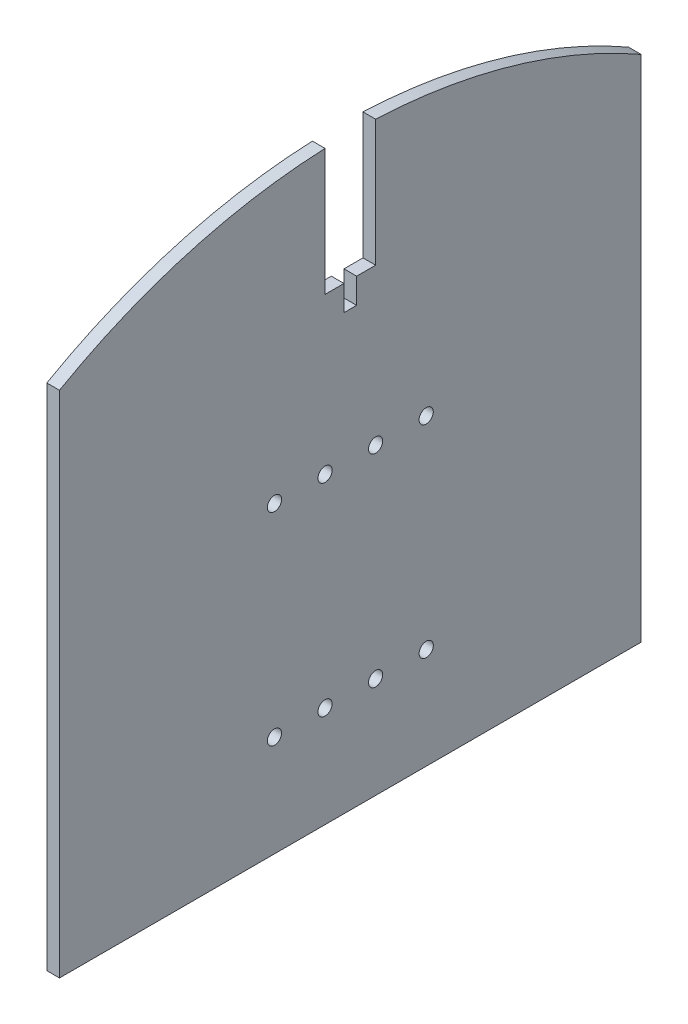
ISO-10303-21;
HEADER;
FILE_DESCRIPTION(('STEP AP214'),'2;1');
FILE_NAME('part.step','',(''),(''),'','','');
FILE_SCHEMA(('AUTOMOTIVE_DESIGN { 1 0 10303 214 1 1 1 1 }'));
ENDSEC;
DATA;
#1=APPLICATION_CONTEXT('core data for automotive mechanical design processes');
#2=APPLICATION_PROTOCOL_DEFINITION('international standard','automotive_design',2000,#1);
#3=PRODUCT_CONTEXT('',#1,'mechanical');
#4=PRODUCT('Part','Part','',(#3));
#5=PRODUCT_RELATED_PRODUCT_CATEGORY('part','',(#4));
#6=PRODUCT_DEFINITION_FORMATION('','',#4);
#7=PRODUCT_DEFINITION_CONTEXT('part definition',#1,'design');
#8=PRODUCT_DEFINITION('design','',#6,#7);
#9=PRODUCT_DEFINITION_SHAPE('','',#8);
#10=(LENGTH_UNIT() NAMED_UNIT(*) SI_UNIT(.MILLI.,.METRE.));
#11=(NAMED_UNIT(*) PLANE_ANGLE_UNIT() SI_UNIT($,.RADIAN.));
#12=(NAMED_UNIT(*) SI_UNIT($,.STERADIAN.) SOLID_ANGLE_UNIT());
#13=UNCERTAINTY_MEASURE_WITH_UNIT(LENGTH_MEASURE(1.E-05),#10,'distance_accuracy_value','');
#14=(GEOMETRIC_REPRESENTATION_CONTEXT(3) GLOBAL_UNCERTAINTY_ASSIGNED_CONTEXT((#13)) GLOBAL_UNIT_ASSIGNED_CONTEXT((#10,
#11,#12)) REPRESENTATION_CONTEXT('',''));
#15=CARTESIAN_POINT('',(0.,0.,0.));
#16=DIRECTION('',(0.,0.,1.));
#17=DIRECTION('',(1.,0.,0.));
#18=AXIS2_PLACEMENT_3D('',#15,#16,#17);
#19=CARTESIAN_POINT('',(6.35,230.611929367035,3.17500000000004));
#20=DIRECTION('',(0.,0.,1.));
#21=DIRECTION('',(0.,-1.,0.));
#22=AXIS2_PLACEMENT_3D('',#19,#20,#21);
#23=PLANE('',#22);
#24=DIRECTION('',(0.,1.,0.));
#25=VECTOR('',#24,1.);
#26=CARTESIAN_POINT('',(0.,230.611929367035,3.17500000000004));
#27=LINE('',#26,#25);
#28=CARTESIAN_POINT('',(0.,217.911929367035,3.17500000000004));
#29=VERTEX_POINT('',#28);
#30=CARTESIAN_POINT('',(0.,230.611929367035,3.17500000000004));
#31=VERTEX_POINT('',#30);
#32=EDGE_CURVE('E152',#29,#31,#27,.T.);
#33=ORIENTED_EDGE('',*,*,#32,.T.);
#34=DIRECTION('',(-1.,0.,0.));
#35=VECTOR('',#34,1.);
#36=CARTESIAN_POINT('',(6.35,230.611929367035,3.17500000000004));
#37=LINE('',#36,#35);
#38=CARTESIAN_POINT('',(6.35,230.611929367035,3.17500000000004));
#39=VERTEX_POINT('',#38);
#40=EDGE_CURVE('E11',#39,#31,#37,.T.);
#41=ORIENTED_EDGE('',*,*,#40,.F.);
#42=DIRECTION('',(0.,1.,0.));
#43=VECTOR('',#42,1.);
#44=CARTESIAN_POINT('',(6.35,230.611929367035,3.17500000000004));
#45=LINE('',#44,#43);
#46=CARTESIAN_POINT('',(6.35,217.911929367035,3.17500000000004));
#47=VERTEX_POINT('',#46);
#48=EDGE_CURVE('E176',#47,#39,#45,.T.);
#49=ORIENTED_EDGE('',*,*,#48,.F.);
#50=DIRECTION('',(-1.,0.,0.));
#51=VECTOR('',#50,1.);
#52=CARTESIAN_POINT('',(6.35,217.911929367035,3.17500000000004));
#53=LINE('',#52,#51);
#54=EDGE_CURVE('E148',#47,#29,#53,.T.);
#55=ORIENTED_EDGE('',*,*,#54,.T.);
#56=EDGE_LOOP('',(#33,#41,#49,#55));
#57=FACE_BOUND('',#56,.T.);
#58=ADVANCED_FACE('F32',(#57),#23,.F.);
#59=CARTESIAN_POINT('',(6.35,230.611929367035,12.7));
#60=DIRECTION('',(0.,-1.,0.));
#61=DIRECTION('',(0.,0.,-1.));
#62=AXIS2_PLACEMENT_3D('',#59,#60,#61);
#63=PLANE('',#62);
#64=DIRECTION('',(0.,0.,1.));
#65=VECTOR('',#64,1.);
#66=CARTESIAN_POINT('',(0.,230.611929367035,12.7));
#67=LINE('',#66,#65);
#68=CARTESIAN_POINT('',(0.,230.611929367035,12.7));
#69=VERTEX_POINT('',#68);
#70=EDGE_CURVE('E155',#31,#69,#67,.T.);
#71=ORIENTED_EDGE('',*,*,#70,.T.);
#72=DIRECTION('',(-1.,0.,0.));
#73=VECTOR('',#72,1.);
#74=CARTESIAN_POINT('',(6.35,230.611929367035,12.7));
#75=LINE('',#74,#73);
#76=CARTESIAN_POINT('',(6.35,230.611929367035,12.7));
#77=VERTEX_POINT('',#76);
#78=EDGE_CURVE('E40',#77,#69,#75,.T.);
#79=ORIENTED_EDGE('',*,*,#78,.F.);
#80=DIRECTION('',(0.,0.,1.));
#81=VECTOR('',#80,1.);
#82=CARTESIAN_POINT('',(6.35,230.611929367035,12.7));
#83=LINE('',#82,#81);
#84=EDGE_CURVE('E103',#39,#77,#83,.T.);
#85=ORIENTED_EDGE('',*,*,#84,.F.);
#86=ORIENTED_EDGE('',*,*,#40,.T.);
#87=EDGE_LOOP('',(#71,#79,#85,#86));
#88=FACE_BOUND('',#87,.T.);
#89=ADVANCED_FACE('F254',(#88),#63,.F.);
#90=CARTESIAN_POINT('',(6.35,294.111929367035,12.7));
#91=DIRECTION('',(0.,0.,1.));
#92=DIRECTION('',(0.,-1.,0.));
#93=AXIS2_PLACEMENT_3D('',#90,#91,#92);
#94=PLANE('',#93);
#95=DIRECTION('',(0.,1.,0.));
#96=VECTOR('',#95,1.);
#97=CARTESIAN_POINT('',(0.,294.111929367035,12.7));
#98=LINE('',#97,#96);
#99=CARTESIAN_POINT('',(0.,294.111929367035,12.7));
#100=VERTEX_POINT('',#99);
#101=EDGE_CURVE('E158',#69,#100,#98,.T.);
#102=ORIENTED_EDGE('',*,*,#101,.T.);
#103=DIRECTION('',(-1.,0.,0.));
#104=VECTOR('',#103,1.);
#105=CARTESIAN_POINT('',(6.35,294.111929367035,12.7));
#106=LINE('',#105,#104);
#107=CARTESIAN_POINT('',(6.35,294.111929367035,12.7));
#108=VERTEX_POINT('',#107);
#109=EDGE_CURVE('E195',#108,#100,#106,.T.);
#110=ORIENTED_EDGE('',*,*,#109,.F.);
#111=DIRECTION('',(0.,1.,0.));
#112=VECTOR('',#111,1.);
#113=CARTESIAN_POINT('',(6.35,294.111929367035,12.7));
#114=LINE('',#113,#112);
#115=EDGE_CURVE('E203',#77,#108,#114,.T.);
#116=ORIENTED_EDGE('',*,*,#115,.F.);
#117=ORIENTED_EDGE('',*,*,#78,.T.);
#118=EDGE_LOOP('',(#102,#110,#116,#117));
#119=FACE_BOUND('',#118,.T.);
#120=ADVANCED_FACE('F201',(#119),#94,.F.);
#121=CARTESIAN_POINT('',(6.35,0.,0.));
#122=DIRECTION('',(-1.,0.,0.));
#123=DIRECTION('',(0.,0.,1.));
#124=AXIS2_PLACEMENT_3D('',#121,#122,#123);
#125=CYLINDRICAL_SURFACE('',#124,294.386);
#126=CARTESIAN_POINT('',(0.,0.,0.));
#127=DIRECTION('',(1.,0.,0.));
#128=DIRECTION('',(0.,0.,1.));
#129=AXIS2_PLACEMENT_3D('',#126,#127,#128);
#130=CIRCLE('',#129,294.386);
#131=CARTESIAN_POINT('',(0.,255.602258393779,146.05));
#132=VERTEX_POINT('',#131);
#133=EDGE_CURVE('E160',#100,#132,#130,.T.);
#134=ORIENTED_EDGE('',*,*,#133,.T.);
#135=DIRECTION('',(-1.,0.,0.));
#136=VECTOR('',#135,1.);
#137=CARTESIAN_POINT('',(6.35,255.602258393779,146.05));
#138=LINE('',#137,#136);
#139=CARTESIAN_POINT('',(6.35,255.602258393779,146.05));
#140=VERTEX_POINT('',#139);
#141=EDGE_CURVE('E192',#140,#132,#138,.T.);
#142=ORIENTED_EDGE('',*,*,#141,.F.);
#143=CARTESIAN_POINT('',(6.35,0.,0.));
#144=DIRECTION('',(1.,0.,0.));
#145=DIRECTION('',(0.,0.,1.));
#146=AXIS2_PLACEMENT_3D('',#143,#144,#145);
#147=CIRCLE('',#146,294.386);
#148=EDGE_CURVE('E220',#108,#140,#147,.T.);
#149=ORIENTED_EDGE('',*,*,#148,.F.);
#150=ORIENTED_EDGE('',*,*,#109,.T.);
#151=EDGE_LOOP('',(#134,#142,#149,#150));
#152=FACE_BOUND('',#151,.T.);
#153=ADVANCED_FACE('F211',(#152),#125,.T.);
#154=CARTESIAN_POINT('',(6.35,255.602258393779,146.05));
#155=DIRECTION('',(0.,0.,-1.));
#156=DIRECTION('',(-1.,0.,0.));
#157=AXIS2_PLACEMENT_3D('',#154,#155,#156);
#158=PLANE('',#157);
#159=DIRECTION('',(0.,-1.,0.));
#160=VECTOR('',#159,1.);
#161=CARTESIAN_POINT('',(0.,255.602258393779,146.05));
#162=LINE('',#161,#160);
#163=CARTESIAN_POINT('',(0.,0.,146.05));
#164=VERTEX_POINT('',#163);
#165=EDGE_CURVE('E162',#132,#164,#162,.T.);
#166=ORIENTED_EDGE('',*,*,#165,.T.);
#167=DIRECTION('',(-1.,0.,0.));
#168=VECTOR('',#167,1.);
#169=CARTESIAN_POINT('',(6.35,0.,146.05));
#170=LINE('',#169,#168);
#171=CARTESIAN_POINT('',(6.35,0.,146.05));
#172=VERTEX_POINT('',#171);
#173=EDGE_CURVE('E189',#172,#164,#170,.T.);
#174=ORIENTED_EDGE('',*,*,#173,.F.);
#175=DIRECTION('',(0.,-1.,0.));
#176=VECTOR('',#175,1.);
#177=CARTESIAN_POINT('',(6.35,255.602258393779,146.05));
#178=LINE('',#177,#176);
#179=EDGE_CURVE('E217',#140,#172,#178,.T.);
#180=ORIENTED_EDGE('',*,*,#179,.F.);
#181=ORIENTED_EDGE('',*,*,#141,.T.);
#182=EDGE_LOOP('',(#166,#174,#180,#181));
#183=FACE_BOUND('',#182,.T.);
#184=ADVANCED_FACE('F215',(#183),#158,.F.);
#185=CARTESIAN_POINT('',(6.35,0.,0.));
#186=DIRECTION('',(0.,1.,0.));
#187=DIRECTION('',(0.,0.,1.));
#188=AXIS2_PLACEMENT_3D('',#185,#186,#187);
#189=PLANE('',#188);
#190=DIRECTION('',(0.,0.,-1.));
#191=VECTOR('',#190,1.);
#192=CARTESIAN_POINT('',(0.,0.,0.));
#193=LINE('',#192,#191);
#194=CARTESIAN_POINT('',(0.,0.,-146.05));
#195=VERTEX_POINT('',#194);
#196=EDGE_CURVE('E165',#164,#195,#193,.T.);
#197=ORIENTED_EDGE('',*,*,#196,.T.);
#198=DIRECTION('',(-1.,0.,0.));
#199=VECTOR('',#198,1.);
#200=CARTESIAN_POINT('',(6.35,0.,-146.05));
#201=LINE('',#200,#199);
#202=CARTESIAN_POINT('',(6.35,0.,-146.05));
#203=VERTEX_POINT('',#202);
#204=EDGE_CURVE('E186',#203,#195,#201,.T.);
#205=ORIENTED_EDGE('',*,*,#204,.F.);
#206=DIRECTION('',(0.,0.,-1.));
#207=VECTOR('',#206,1.);
#208=CARTESIAN_POINT('',(6.35,0.,146.05));
#209=LINE('',#208,#207);
#210=EDGE_CURVE('E219',#172,#203,#209,.T.);
#211=ORIENTED_EDGE('',*,*,#210,.F.);
#212=ORIENTED_EDGE('',*,*,#173,.T.);
#213=EDGE_LOOP('',(#197,#205,#211,#212));
#214=FACE_BOUND('',#213,.T.);
#215=ADVANCED_FACE('F267',(#214),#189,.F.);
#216=CARTESIAN_POINT('',(6.35,255.602258393779,-146.05));
#217=DIRECTION('',(0.,0.,1.));
#218=DIRECTION('',(1.,0.,0.));
#219=AXIS2_PLACEMENT_3D('',#216,#217,#218);
#220=PLANE('',#219);
#221=DIRECTION('',(0.,1.,0.));
#222=VECTOR('',#221,1.);
#223=CARTESIAN_POINT('',(0.,255.602258393779,-146.05));
#224=LINE('',#223,#222);
#225=CARTESIAN_POINT('',(0.,255.602258393779,-146.05));
#226=VERTEX_POINT('',#225);
#227=EDGE_CURVE('E167',#195,#226,#224,.T.);
#228=ORIENTED_EDGE('',*,*,#227,.T.);
#229=DIRECTION('',(-1.,0.,0.));
#230=VECTOR('',#229,1.);
#231=CARTESIAN_POINT('',(6.35,255.602258393779,-146.05));
#232=LINE('',#231,#230);
#233=CARTESIAN_POINT('',(6.35,255.602258393779,-146.05));
#234=VERTEX_POINT('',#233);
#235=EDGE_CURVE('E183',#234,#226,#232,.T.);
#236=ORIENTED_EDGE('',*,*,#235,.F.);
#237=DIRECTION('',(0.,1.,0.));
#238=VECTOR('',#237,1.);
#239=CARTESIAN_POINT('',(6.35,255.602258393779,-146.05));
#240=LINE('',#239,#238);
#241=EDGE_CURVE('E222',#203,#234,#240,.T.);
#242=ORIENTED_EDGE('',*,*,#241,.F.);
#243=ORIENTED_EDGE('',*,*,#204,.T.);
#244=EDGE_LOOP('',(#228,#236,#242,#243));
#245=FACE_BOUND('',#244,.T.);
#246=ADVANCED_FACE('F270',(#245),#220,.F.);
#247=CARTESIAN_POINT('',(6.35,0.,0.));
#248=DIRECTION('',(-1.,0.,0.));
#249=DIRECTION('',(0.,0.,1.));
#250=AXIS2_PLACEMENT_3D('',#247,#248,#249);
#251=CYLINDRICAL_SURFACE('',#250,294.386);
#252=CARTESIAN_POINT('',(0.,0.,0.));
#253=DIRECTION('',(1.,0.,0.));
#254=DIRECTION('',(0.,0.,1.));
#255=AXIS2_PLACEMENT_3D('',#252,#253,#254);
#256=CIRCLE('',#255,294.386);
#257=CARTESIAN_POINT('',(0.,294.111929367035,-12.7));
#258=VERTEX_POINT('',#257);
#259=EDGE_CURVE('E169',#226,#258,#256,.T.);
#260=ORIENTED_EDGE('',*,*,#259,.T.);
#261=DIRECTION('',(-1.,0.,0.));
#262=VECTOR('',#261,1.);
#263=CARTESIAN_POINT('',(6.35,294.111929367035,-12.7));
#264=LINE('',#263,#262);
#265=CARTESIAN_POINT('',(6.35,294.111929367035,-12.7));
#266=VERTEX_POINT('',#265);
#267=EDGE_CURVE('E180',#266,#258,#264,.T.);
#268=ORIENTED_EDGE('',*,*,#267,.F.);
#269=CARTESIAN_POINT('',(6.35,0.,0.));
#270=DIRECTION('',(1.,0.,0.));
#271=DIRECTION('',(0.,0.,1.));
#272=AXIS2_PLACEMENT_3D('',#269,#270,#271);
#273=CIRCLE('',#272,294.386);
#274=EDGE_CURVE('E228',#234,#266,#273,.T.);
#275=ORIENTED_EDGE('',*,*,#274,.F.);
#276=ORIENTED_EDGE('',*,*,#235,.T.);
#277=EDGE_LOOP('',(#260,#268,#275,#276));
#278=FACE_BOUND('',#277,.T.);
#279=ADVANCED_FACE('F234',(#278),#251,.T.);
#280=CARTESIAN_POINT('',(6.35,230.611929367035,-12.6999999999999));
#281=DIRECTION('',(0.,0.,-1.));
#282=DIRECTION('',(0.,1.,0.));
#283=AXIS2_PLACEMENT_3D('',#280,#281,#282);
#284=PLANE('',#283);
#285=DIRECTION('',(0.,-1.,0.));
#286=VECTOR('',#285,1.);
#287=CARTESIAN_POINT('',(0.,230.611929367035,-12.6999999999999));
#288=LINE('',#287,#286);
#289=CARTESIAN_POINT('',(0.,230.611929367035,-12.6999999999999));
#290=VERTEX_POINT('',#289);
#291=EDGE_CURVE('E171',#258,#290,#288,.T.);
#292=ORIENTED_EDGE('',*,*,#291,.T.);
#293=DIRECTION('',(-1.,0.,0.));
#294=VECTOR('',#293,1.);
#295=CARTESIAN_POINT('',(6.35,230.611929367035,-12.6999999999999));
#296=LINE('',#295,#294);
#297=CARTESIAN_POINT('',(6.35,230.611929367035,-12.6999999999999));
#298=VERTEX_POINT('',#297);
#299=EDGE_CURVE('E143',#298,#290,#296,.T.);
#300=ORIENTED_EDGE('',*,*,#299,.F.);
#301=DIRECTION('',(0.,-1.,0.));
#302=VECTOR('',#301,1.);
#303=CARTESIAN_POINT('',(6.35,230.611929367035,-12.6999999999999));
#304=LINE('',#303,#302);
#305=EDGE_CURVE('E134',#266,#298,#304,.T.);
#306=ORIENTED_EDGE('',*,*,#305,.F.);
#307=ORIENTED_EDGE('',*,*,#267,.T.);
#308=EDGE_LOOP('',(#292,#300,#306,#307));
#309=FACE_BOUND('',#308,.T.);
#310=ADVANCED_FACE('F238',(#309),#284,.F.);
#311=CARTESIAN_POINT('',(6.35,230.611929367035,-3.17499999999996));
#312=DIRECTION('',(0.,-1.,0.));
#313=DIRECTION('',(0.,0.,-1.));
#314=AXIS2_PLACEMENT_3D('',#311,#312,#313);
#315=PLANE('',#314);
#316=DIRECTION('',(0.,0.,1.));
#317=VECTOR('',#316,1.);
#318=CARTESIAN_POINT('',(0.,230.611929367035,-3.17499999999996));
#319=LINE('',#318,#317);
#320=CARTESIAN_POINT('',(0.,230.611929367035,-3.17499999999996));
#321=VERTEX_POINT('',#320);
#322=EDGE_CURVE('E142',#290,#321,#319,.T.);
#323=ORIENTED_EDGE('',*,*,#322,.T.);
#324=DIRECTION('',(-1.,0.,0.));
#325=VECTOR('',#324,1.);
#326=CARTESIAN_POINT('',(6.35,230.611929367035,-3.17499999999996));
#327=LINE('',#326,#325);
#328=CARTESIAN_POINT('',(6.35,230.611929367035,-3.17499999999996));
#329=VERTEX_POINT('',#328);
#330=EDGE_CURVE('E139',#329,#321,#327,.T.);
#331=ORIENTED_EDGE('',*,*,#330,.F.);
#332=DIRECTION('',(0.,0.,1.));
#333=VECTOR('',#332,1.);
#334=CARTESIAN_POINT('',(6.35,230.611929367035,-3.17499999999996));
#335=LINE('',#334,#333);
#336=EDGE_CURVE('E128',#298,#329,#335,.T.);
#337=ORIENTED_EDGE('',*,*,#336,.F.);
#338=ORIENTED_EDGE('',*,*,#299,.T.);
#339=EDGE_LOOP('',(#323,#331,#337,#338));
#340=FACE_BOUND('',#339,.T.);
#341=ADVANCED_FACE('F140',(#340),#315,.F.);
#342=CARTESIAN_POINT('',(6.35,217.911929367035,-3.17499999999996));
#343=DIRECTION('',(0.,0.,-1.));
#344=DIRECTION('',(0.,1.,0.));
#345=AXIS2_PLACEMENT_3D('',#342,#343,#344);
#346=PLANE('',#345);
#347=DIRECTION('',(0.,-1.,0.));
#348=VECTOR('',#347,1.);
#349=CARTESIAN_POINT('',(0.,217.911929367035,-3.17499999999996));
#350=LINE('',#349,#348);
#351=CARTESIAN_POINT('',(0.,217.911929367035,-3.17499999999996));
#352=VERTEX_POINT('',#351);
#353=EDGE_CURVE('E89',#321,#352,#350,.T.);
#354=ORIENTED_EDGE('',*,*,#353,.T.);
#355=DIRECTION('',(-1.,0.,0.));
#356=VECTOR('',#355,1.);
#357=CARTESIAN_POINT('',(6.35,217.911929367035,-3.17499999999996));
#358=LINE('',#357,#356);
#359=CARTESIAN_POINT('',(6.35,217.911929367035,-3.17499999999996));
#360=VERTEX_POINT('',#359);
#361=EDGE_CURVE('E144',#360,#352,#358,.T.);
#362=ORIENTED_EDGE('',*,*,#361,.F.);
#363=DIRECTION('',(0.,-1.,0.));
#364=VECTOR('',#363,1.);
#365=CARTESIAN_POINT('',(6.35,217.911929367035,-3.17499999999996));
#366=LINE('',#365,#364);
#367=EDGE_CURVE('E132',#329,#360,#366,.T.);
#368=ORIENTED_EDGE('',*,*,#367,.F.);
#369=ORIENTED_EDGE('',*,*,#330,.T.);
#370=EDGE_LOOP('',(#354,#362,#368,#369));
#371=FACE_BOUND('',#370,.T.);
#372=ADVANCED_FACE('F146',(#371),#346,.F.);
#373=CARTESIAN_POINT('',(6.35,217.911929367035,3.17500000000004));
#374=DIRECTION('',(0.,-1.,0.));
#375=DIRECTION('',(0.,0.,-1.));
#376=AXIS2_PLACEMENT_3D('',#373,#374,#375);
#377=PLANE('',#376);
#378=DIRECTION('',(0.,0.,1.));
#379=VECTOR('',#378,1.);
#380=CARTESIAN_POINT('',(0.,217.911929367035,3.17500000000004));
#381=LINE('',#380,#379);
#382=EDGE_CURVE('E95',#352,#29,#381,.T.);
#383=ORIENTED_EDGE('',*,*,#382,.T.);
#384=ORIENTED_EDGE('',*,*,#54,.F.);
#385=DIRECTION('',(0.,0.,1.));
#386=VECTOR('',#385,1.);
#387=CARTESIAN_POINT('',(6.35,217.911929367035,3.17500000000004));
#388=LINE('',#387,#386);
#389=EDGE_CURVE('E48',#360,#47,#388,.T.);
#390=ORIENTED_EDGE('',*,*,#389,.F.);
#391=ORIENTED_EDGE('',*,*,#361,.T.);
#392=EDGE_LOOP('',(#383,#384,#390,#391));
#393=FACE_BOUND('',#392,.T.);
#394=ADVANCED_FACE('F242',(#393),#377,.F.);
#395=CARTESIAN_POINT('',(6.35,0.,0.));
#396=DIRECTION('',(-1.,0.,0.));
#397=DIRECTION('',(0.,0.,1.));
#398=AXIS2_PLACEMENT_3D('',#395,#396,#397);
#399=PLANE('',#398);
#400=CARTESIAN_POINT('',(6.34999999999999,152.4,12.6999999999996));
#401=DIRECTION('',(-1.,0.,0.));
#402=DIRECTION('',(0.,0.,1.));
#403=AXIS2_PLACEMENT_3D('',#400,#401,#402);
#404=CIRCLE('',#403,3.5687);
#405=CARTESIAN_POINT('',(6.34999999999999,152.4,16.2686999999996));
#406=VERTEX_POINT('',#405);
#407=EDGE_CURVE('E396',#406,#406,#404,.F.);
#408=ORIENTED_EDGE('',*,*,#407,.F.);
#409=EDGE_LOOP('',(#408));
#410=FACE_BOUND('',#409,.T.);
#411=CARTESIAN_POINT('',(6.34999999999999,152.4,38.0999999999996));
#412=DIRECTION('',(-1.,0.,0.));
#413=DIRECTION('',(0.,0.,1.));
#414=AXIS2_PLACEMENT_3D('',#411,#412,#413);
#415=CIRCLE('',#414,3.5687);
#416=CARTESIAN_POINT('',(6.34999999999999,152.4,41.6686999999996));
#417=VERTEX_POINT('',#416);
#418=EDGE_CURVE('E400',#417,#417,#415,.F.);
#419=ORIENTED_EDGE('',*,*,#418,.F.);
#420=EDGE_LOOP('',(#419));
#421=FACE_BOUND('',#420,.T.);
#422=CARTESIAN_POINT('',(6.34999999999999,50.8,38.1));
#423=DIRECTION('',(-1.,0.,0.));
#424=DIRECTION('',(0.,0.,1.));
#425=AXIS2_PLACEMENT_3D('',#422,#423,#424);
#426=CIRCLE('',#425,3.56869999999999);
#427=CARTESIAN_POINT('',(6.34999999999999,50.8,41.6687));
#428=VERTEX_POINT('',#427);
#429=EDGE_CURVE('E409',#428,#428,#426,.F.);
#430=ORIENTED_EDGE('',*,*,#429,.F.);
#431=EDGE_LOOP('',(#430));
#432=FACE_BOUND('',#431,.T.);
#433=CARTESIAN_POINT('',(6.34999999999999,50.8,12.7));
#434=DIRECTION('',(-1.,0.,0.));
#435=DIRECTION('',(0.,0.,1.));
#436=AXIS2_PLACEMENT_3D('',#433,#434,#435);
#437=CIRCLE('',#436,3.5687);
#438=CARTESIAN_POINT('',(6.34999999999999,50.8,16.2687));
#439=VERTEX_POINT('',#438);
#440=EDGE_CURVE('E415',#439,#439,#437,.F.);
#441=ORIENTED_EDGE('',*,*,#440,.F.);
#442=EDGE_LOOP('',(#441));
#443=FACE_BOUND('',#442,.T.);
#444=CARTESIAN_POINT('',(6.34999999999999,152.4,-38.0999999999996));
#445=DIRECTION('',(-1.,0.,0.));
#446=DIRECTION('',(0.,0.,1.));
#447=AXIS2_PLACEMENT_3D('',#444,#445,#446);
#448=CIRCLE('',#447,3.5687);
#449=CARTESIAN_POINT('',(6.34999999999999,152.4,-34.5312999999996));
#450=VERTEX_POINT('',#449);
#451=EDGE_CURVE('E421',#450,#450,#448,.F.);
#452=ORIENTED_EDGE('',*,*,#451,.F.);
#453=EDGE_LOOP('',(#452));
#454=FACE_BOUND('',#453,.T.);
#455=CARTESIAN_POINT('',(6.34999999999999,152.4,-12.6999999999996));
#456=DIRECTION('',(-1.,0.,0.));
#457=DIRECTION('',(0.,0.,1.));
#458=AXIS2_PLACEMENT_3D('',#455,#456,#457);
#459=CIRCLE('',#458,3.5687);
#460=CARTESIAN_POINT('',(6.34999999999999,152.4,-9.13129999999964));
#461=VERTEX_POINT('',#460);
#462=EDGE_CURVE('E427',#461,#461,#459,.F.);
#463=ORIENTED_EDGE('',*,*,#462,.F.);
#464=EDGE_LOOP('',(#463));
#465=FACE_BOUND('',#464,.T.);
#466=CARTESIAN_POINT('',(6.34999999999999,50.8,-38.1));
#467=DIRECTION('',(-1.,0.,0.));
#468=DIRECTION('',(0.,0.,1.));
#469=AXIS2_PLACEMENT_3D('',#466,#467,#468);
#470=CIRCLE('',#469,3.56869999999999);
#471=CARTESIAN_POINT('',(6.34999999999999,50.8,-34.5313));
#472=VERTEX_POINT('',#471);
#473=EDGE_CURVE('E433',#472,#472,#470,.F.);
#474=ORIENTED_EDGE('',*,*,#473,.F.);
#475=EDGE_LOOP('',(#474));
#476=FACE_BOUND('',#475,.T.);
#477=CARTESIAN_POINT('',(6.34999999999999,50.8,-12.7));
#478=DIRECTION('',(-1.,0.,0.));
#479=DIRECTION('',(0.,0.,1.));
#480=AXIS2_PLACEMENT_3D('',#477,#478,#479);
#481=CIRCLE('',#480,3.5687);
#482=CARTESIAN_POINT('',(6.34999999999999,50.8,-9.1313));
#483=VERTEX_POINT('',#482);
#484=EDGE_CURVE('E156',#483,#483,#481,.F.);
#485=ORIENTED_EDGE('',*,*,#484,.F.);
#486=EDGE_LOOP('',(#485));
#487=FACE_BOUND('',#486,.T.);
#488=ORIENTED_EDGE('',*,*,#48,.T.);
#489=ORIENTED_EDGE('',*,*,#84,.T.);
#490=ORIENTED_EDGE('',*,*,#115,.T.);
#491=ORIENTED_EDGE('',*,*,#148,.T.);
#492=ORIENTED_EDGE('',*,*,#179,.T.);
#493=ORIENTED_EDGE('',*,*,#210,.T.);
#494=ORIENTED_EDGE('',*,*,#241,.T.);
#495=ORIENTED_EDGE('',*,*,#274,.T.);
#496=ORIENTED_EDGE('',*,*,#305,.T.);
#497=ORIENTED_EDGE('',*,*,#336,.T.);
#498=ORIENTED_EDGE('',*,*,#367,.T.);
#499=ORIENTED_EDGE('',*,*,#389,.T.);
#500=EDGE_LOOP('',(#488,#489,#490,#491,#492,#493,#494,#495,#496,#497,#498,#499));
#501=FACE_BOUND('',#500,.T.);
#502=ADVANCED_FACE('F130',(#410,#421,#432,#443,#454,#465,#476,#487,#501),#399,.F.);
#503=CARTESIAN_POINT('',(0.,0.,0.));
#504=DIRECTION('',(-1.,0.,0.));
#505=DIRECTION('',(0.,0.,1.));
#506=AXIS2_PLACEMENT_3D('',#503,#504,#505);
#507=PLANE('',#506);
#508=CARTESIAN_POINT('',(0.,152.4,12.6999999999996));
#509=DIRECTION('',(1.,0.,0.));
#510=DIRECTION('',(0.,0.,1.));
#511=AXIS2_PLACEMENT_3D('',#508,#509,#510);
#512=CIRCLE('',#511,3.5687);
#513=CARTESIAN_POINT('',(0.,152.4,16.2686999999996));
#514=VERTEX_POINT('',#513);
#515=EDGE_CURVE('E393',#514,#514,#512,.T.);
#516=ORIENTED_EDGE('',*,*,#515,.T.);
#517=EDGE_LOOP('',(#516));
#518=FACE_BOUND('',#517,.T.);
#519=CARTESIAN_POINT('',(0.,152.4,38.0999999999996));
#520=DIRECTION('',(1.,0.,0.));
#521=DIRECTION('',(0.,0.,1.));
#522=AXIS2_PLACEMENT_3D('',#519,#520,#521);
#523=CIRCLE('',#522,3.5687);
#524=CARTESIAN_POINT('',(0.,152.4,41.6686999999996));
#525=VERTEX_POINT('',#524);
#526=EDGE_CURVE('E397',#525,#525,#523,.T.);
#527=ORIENTED_EDGE('',*,*,#526,.T.);
#528=EDGE_LOOP('',(#527));
#529=FACE_BOUND('',#528,.T.);
#530=CARTESIAN_POINT('',(0.,50.8,38.1));
#531=DIRECTION('',(1.,0.,0.));
#532=DIRECTION('',(0.,0.,1.));
#533=AXIS2_PLACEMENT_3D('',#530,#531,#532);
#534=CIRCLE('',#533,3.56869999999999);
#535=CARTESIAN_POINT('',(0.,50.8,41.6687));
#536=VERTEX_POINT('',#535);
#537=EDGE_CURVE('E406',#536,#536,#534,.T.);
#538=ORIENTED_EDGE('',*,*,#537,.T.);
#539=EDGE_LOOP('',(#538));
#540=FACE_BOUND('',#539,.T.);
#541=CARTESIAN_POINT('',(0.,50.8,12.7));
#542=DIRECTION('',(1.,0.,0.));
#543=DIRECTION('',(0.,0.,1.));
#544=AXIS2_PLACEMENT_3D('',#541,#542,#543);
#545=CIRCLE('',#544,3.5687);
#546=CARTESIAN_POINT('',(0.,50.8,16.2687));
#547=VERTEX_POINT('',#546);
#548=EDGE_CURVE('E412',#547,#547,#545,.T.);
#549=ORIENTED_EDGE('',*,*,#548,.T.);
#550=EDGE_LOOP('',(#549));
#551=FACE_BOUND('',#550,.T.);
#552=CARTESIAN_POINT('',(0.,152.4,-38.0999999999996));
#553=DIRECTION('',(1.,0.,0.));
#554=DIRECTION('',(0.,0.,-1.));
#555=AXIS2_PLACEMENT_3D('',#552,#553,#554);
#556=CIRCLE('',#555,3.5687);
#557=CARTESIAN_POINT('',(0.,152.4,-41.6686999999996));
#558=VERTEX_POINT('',#557);
#559=EDGE_CURVE('E418',#558,#558,#556,.T.);
#560=ORIENTED_EDGE('',*,*,#559,.T.);
#561=EDGE_LOOP('',(#560));
#562=FACE_BOUND('',#561,.T.);
#563=CARTESIAN_POINT('',(0.,152.4,-12.6999999999996));
#564=DIRECTION('',(1.,0.,0.));
#565=DIRECTION('',(0.,0.,-1.));
#566=AXIS2_PLACEMENT_3D('',#563,#564,#565);
#567=CIRCLE('',#566,3.5687);
#568=CARTESIAN_POINT('',(0.,152.4,-16.2686999999996));
#569=VERTEX_POINT('',#568);
#570=EDGE_CURVE('E424',#569,#569,#567,.T.);
#571=ORIENTED_EDGE('',*,*,#570,.T.);
#572=EDGE_LOOP('',(#571));
#573=FACE_BOUND('',#572,.T.);
#574=CARTESIAN_POINT('',(0.,50.8,-38.1));
#575=DIRECTION('',(1.,0.,0.));
#576=DIRECTION('',(0.,0.,-1.));
#577=AXIS2_PLACEMENT_3D('',#574,#575,#576);
#578=CIRCLE('',#577,3.56869999999999);
#579=CARTESIAN_POINT('',(0.,50.8,-41.6687));
#580=VERTEX_POINT('',#579);
#581=EDGE_CURVE('E430',#580,#580,#578,.T.);
#582=ORIENTED_EDGE('',*,*,#581,.T.);
#583=EDGE_LOOP('',(#582));
#584=FACE_BOUND('',#583,.T.);
#585=CARTESIAN_POINT('',(0.,50.8,-12.7));
#586=DIRECTION('',(1.,0.,0.));
#587=DIRECTION('',(0.,0.,-1.));
#588=AXIS2_PLACEMENT_3D('',#585,#586,#587);
#589=CIRCLE('',#588,3.5687);
#590=CARTESIAN_POINT('',(0.,50.8,-16.2687));
#591=VERTEX_POINT('',#590);
#592=EDGE_CURVE('E436',#591,#591,#589,.T.);
#593=ORIENTED_EDGE('',*,*,#592,.T.);
#594=EDGE_LOOP('',(#593));
#595=FACE_BOUND('',#594,.T.);
#596=ORIENTED_EDGE('',*,*,#32,.F.);
#597=ORIENTED_EDGE('',*,*,#382,.F.);
#598=ORIENTED_EDGE('',*,*,#353,.F.);
#599=ORIENTED_EDGE('',*,*,#322,.F.);
#600=ORIENTED_EDGE('',*,*,#291,.F.);
#601=ORIENTED_EDGE('',*,*,#259,.F.);
#602=ORIENTED_EDGE('',*,*,#227,.F.);
#603=ORIENTED_EDGE('',*,*,#196,.F.);
#604=ORIENTED_EDGE('',*,*,#165,.F.);
#605=ORIENTED_EDGE('',*,*,#133,.F.);
#606=ORIENTED_EDGE('',*,*,#101,.F.);
#607=ORIENTED_EDGE('',*,*,#70,.F.);
#608=EDGE_LOOP('',(#596,#597,#598,#599,#600,#601,#602,#603,#604,#605,#606,#607));
#609=FACE_BOUND('',#608,.T.);
#610=ADVANCED_FACE('F207',(#518,#529,#540,#551,#562,#573,#584,#595,#609),#507,.T.);
#611=CARTESIAN_POINT('',(149.606,50.8,-12.7));
#612=DIRECTION('',(-1.,0.,0.));
#613=DIRECTION('',(0.,0.,1.));
#614=AXIS2_PLACEMENT_3D('',#611,#612,#613);
#615=CYLINDRICAL_SURFACE('',#614,3.5687);
#616=ORIENTED_EDGE('',*,*,#592,.F.);
#617=EDGE_LOOP('',(#616));
#618=FACE_BOUND('',#617,.T.);
#619=ORIENTED_EDGE('',*,*,#484,.T.);
#620=EDGE_LOOP('',(#619));
#621=FACE_BOUND('',#620,.T.);
#622=ADVANCED_FACE('F307',(#618,#621),#615,.F.);
#623=CARTESIAN_POINT('',(149.606,50.8,-38.1));
#624=DIRECTION('',(-1.,0.,0.));
#625=DIRECTION('',(0.,0.,1.));
#626=AXIS2_PLACEMENT_3D('',#623,#624,#625);
#627=CYLINDRICAL_SURFACE('',#626,3.56869999999999);
#628=ORIENTED_EDGE('',*,*,#581,.F.);
#629=EDGE_LOOP('',(#628));
#630=FACE_BOUND('',#629,.T.);
#631=ORIENTED_EDGE('',*,*,#473,.T.);
#632=EDGE_LOOP('',(#631));
#633=FACE_BOUND('',#632,.T.);
#634=ADVANCED_FACE('F316',(#630,#633),#627,.F.);
#635=CARTESIAN_POINT('',(149.606,152.4,-12.6999999999996));
#636=DIRECTION('',(-1.,0.,0.));
#637=DIRECTION('',(0.,0.,1.));
#638=AXIS2_PLACEMENT_3D('',#635,#636,#637);
#639=CYLINDRICAL_SURFACE('',#638,3.5687);
#640=ORIENTED_EDGE('',*,*,#570,.F.);
#641=EDGE_LOOP('',(#640));
#642=FACE_BOUND('',#641,.T.);
#643=ORIENTED_EDGE('',*,*,#462,.T.);
#644=EDGE_LOOP('',(#643));
#645=FACE_BOUND('',#644,.T.);
#646=ADVANCED_FACE('F326',(#642,#645),#639,.F.);
#647=CARTESIAN_POINT('',(149.606,152.4,-38.0999999999996));
#648=DIRECTION('',(-1.,0.,0.));
#649=DIRECTION('',(0.,0.,1.));
#650=AXIS2_PLACEMENT_3D('',#647,#648,#649);
#651=CYLINDRICAL_SURFACE('',#650,3.5687);
#652=ORIENTED_EDGE('',*,*,#559,.F.);
#653=EDGE_LOOP('',(#652));
#654=FACE_BOUND('',#653,.T.);
#655=ORIENTED_EDGE('',*,*,#451,.T.);
#656=EDGE_LOOP('',(#655));
#657=FACE_BOUND('',#656,.T.);
#658=ADVANCED_FACE('F336',(#654,#657),#651,.F.);
#659=CARTESIAN_POINT('',(149.606,50.8,12.7));
#660=DIRECTION('',(-1.,0.,0.));
#661=DIRECTION('',(0.,0.,1.));
#662=AXIS2_PLACEMENT_3D('',#659,#660,#661);
#663=CYLINDRICAL_SURFACE('',#662,3.5687);
#664=ORIENTED_EDGE('',*,*,#548,.F.);
#665=EDGE_LOOP('',(#664));
#666=FACE_BOUND('',#665,.T.);
#667=ORIENTED_EDGE('',*,*,#440,.T.);
#668=EDGE_LOOP('',(#667));
#669=FACE_BOUND('',#668,.T.);
#670=ADVANCED_FACE('F346',(#666,#669),#663,.F.);
#671=CARTESIAN_POINT('',(149.606,50.8,38.1));
#672=DIRECTION('',(-1.,0.,0.));
#673=DIRECTION('',(0.,0.,1.));
#674=AXIS2_PLACEMENT_3D('',#671,#672,#673);
#675=CYLINDRICAL_SURFACE('',#674,3.56869999999999);
#676=ORIENTED_EDGE('',*,*,#537,.F.);
#677=EDGE_LOOP('',(#676));
#678=FACE_BOUND('',#677,.T.);
#679=ORIENTED_EDGE('',*,*,#429,.T.);
#680=EDGE_LOOP('',(#679));
#681=FACE_BOUND('',#680,.T.);
#682=ADVANCED_FACE('F356',(#678,#681),#675,.F.);
#683=CARTESIAN_POINT('',(149.606,152.4,38.0999999999996));
#684=DIRECTION('',(-1.,0.,0.));
#685=DIRECTION('',(0.,0.,1.));
#686=AXIS2_PLACEMENT_3D('',#683,#684,#685);
#687=CYLINDRICAL_SURFACE('',#686,3.5687);
#688=ORIENTED_EDGE('',*,*,#526,.F.);
#689=EDGE_LOOP('',(#688));
#690=FACE_BOUND('',#689,.T.);
#691=ORIENTED_EDGE('',*,*,#418,.T.);
#692=EDGE_LOOP('',(#691));
#693=FACE_BOUND('',#692,.T.);
#694=ADVANCED_FACE('F366',(#690,#693),#687,.F.);
#695=CARTESIAN_POINT('',(149.606,152.4,12.6999999999996));
#696=DIRECTION('',(-1.,0.,0.));
#697=DIRECTION('',(0.,0.,1.));
#698=AXIS2_PLACEMENT_3D('',#695,#696,#697);
#699=CYLINDRICAL_SURFACE('',#698,3.5687);
#700=ORIENTED_EDGE('',*,*,#515,.F.);
#701=EDGE_LOOP('',(#700));
#702=FACE_BOUND('',#701,.T.);
#703=ORIENTED_EDGE('',*,*,#407,.T.);
#704=EDGE_LOOP('',(#703));
#705=FACE_BOUND('',#704,.T.);
#706=ADVANCED_FACE('F376',(#702,#705),#699,.F.);
#707=CLOSED_SHELL('',(#58,#89,#120,#153,#184,#215,#246,#279,#310,#341,#372,#394,#502,#610,#622,
#634,#646,#658,#670,#682,#694,#706));
#708=MANIFOLD_SOLID_BREP('B2',#707);
#709=ADVANCED_BREP_SHAPE_REPRESENTATION('',(#18,#708),#14);
#710=SHAPE_DEFINITION_REPRESENTATION(#9,#709);
ENDSEC;
END-ISO-10303-21;
